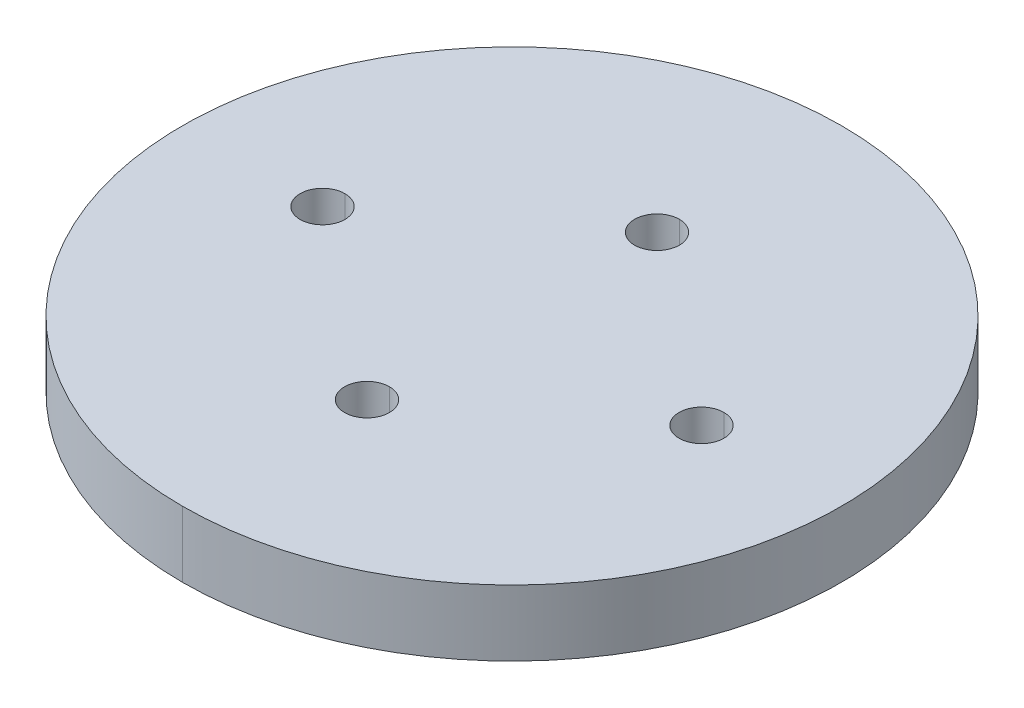
ISO-10303-21;
HEADER;
FILE_DESCRIPTION(('STEP AP214'),'2;1');
FILE_NAME('part.step','',(''),(''),'','','');
FILE_SCHEMA(('AUTOMOTIVE_DESIGN { 1 0 10303 214 1 1 1 1 }'));
ENDSEC;
DATA;
#1=APPLICATION_CONTEXT('core data for automotive mechanical design processes');
#2=APPLICATION_PROTOCOL_DEFINITION('international standard','automotive_design',2000,#1);
#3=PRODUCT_CONTEXT('',#1,'mechanical');
#4=PRODUCT('Part','Part','',(#3));
#5=PRODUCT_RELATED_PRODUCT_CATEGORY('part','',(#4));
#6=PRODUCT_DEFINITION_FORMATION('','',#4);
#7=PRODUCT_DEFINITION_CONTEXT('part definition',#1,'design');
#8=PRODUCT_DEFINITION('design','',#6,#7);
#9=PRODUCT_DEFINITION_SHAPE('','',#8);
#10=(LENGTH_UNIT() NAMED_UNIT(*) SI_UNIT(.MILLI.,.METRE.));
#11=(NAMED_UNIT(*) PLANE_ANGLE_UNIT() SI_UNIT($,.RADIAN.));
#12=(NAMED_UNIT(*) SI_UNIT($,.STERADIAN.) SOLID_ANGLE_UNIT());
#13=UNCERTAINTY_MEASURE_WITH_UNIT(LENGTH_MEASURE(1.E-05),#10,'distance_accuracy_value','');
#14=(GEOMETRIC_REPRESENTATION_CONTEXT(3) GLOBAL_UNCERTAINTY_ASSIGNED_CONTEXT((#13)) GLOBAL_UNIT_ASSIGNED_CONTEXT((#10,
#11,#12)) REPRESENTATION_CONTEXT('',''));
#15=CARTESIAN_POINT('',(0.,0.,0.));
#16=DIRECTION('',(0.,0.,1.));
#17=DIRECTION('',(1.,0.,0.));
#18=AXIS2_PLACEMENT_3D('',#15,#16,#17);
#19=CARTESIAN_POINT('',(0.,0.,0.));
#20=DIRECTION('',(0.,1.,0.));
#21=DIRECTION('',(1.,0.,0.));
#22=AXIS2_PLACEMENT_3D('',#19,#20,#21);
#23=PLANE('',#22);
#24=CARTESIAN_POINT('',(0.,0.,10.9993302496717));
#25=DIRECTION('',(0.,-1.,0.));
#26=DIRECTION('',(0.,0.,1.));
#27=AXIS2_PLACEMENT_3D('',#24,#25,#26);
#28=CIRCLE('',#27,1.7);
#29=CARTESIAN_POINT('',(0.,0.,9.29933024967169));
#30=VERTEX_POINT('',#29);
#31=CARTESIAN_POINT('',(0.,0.,12.6993302496717));
#32=VERTEX_POINT('',#31);
#33=EDGE_CURVE('E40',#30,#32,#28,.T.);
#34=ORIENTED_EDGE('',*,*,#33,.F.);
#35=CARTESIAN_POINT('',(0.,0.,10.9993302496717));
#36=DIRECTION('',(0.,-1.,0.));
#37=DIRECTION('',(0.,0.,1.));
#38=AXIS2_PLACEMENT_3D('',#35,#36,#37);
#39=CIRCLE('',#38,1.7);
#40=EDGE_CURVE('E165',#32,#30,#39,.T.);
#41=ORIENTED_EDGE('',*,*,#40,.F.);
#42=EDGE_LOOP('',(#34,#41));
#43=FACE_BOUND('',#42,.T.);
#44=CARTESIAN_POINT('',(-14.3744897137046,0.,0.));
#45=DIRECTION('',(0.,1.,0.));
#46=DIRECTION('',(0.,0.,1.));
#47=AXIS2_PLACEMENT_3D('',#44,#45,#46);
#48=CIRCLE('',#47,1.7);
#49=CARTESIAN_POINT('',(-14.3744897137046,0.,-1.7));
#50=VERTEX_POINT('',#49);
#51=CARTESIAN_POINT('',(-14.3744897137046,0.,1.7));
#52=VERTEX_POINT('',#51);
#53=EDGE_CURVE('E206',#50,#52,#48,.T.);
#54=ORIENTED_EDGE('',*,*,#53,.T.);
#55=CARTESIAN_POINT('',(-14.3744897137046,0.,0.));
#56=DIRECTION('',(0.,1.,0.));
#57=DIRECTION('',(0.,0.,1.));
#58=AXIS2_PLACEMENT_3D('',#55,#56,#57);
#59=CIRCLE('',#58,1.7);
#60=EDGE_CURVE('E175',#52,#50,#59,.T.);
#61=ORIENTED_EDGE('',*,*,#60,.T.);
#62=EDGE_LOOP('',(#54,#61));
#63=FACE_BOUND('',#62,.T.);
#64=CARTESIAN_POINT('',(0.,0.,-10.9993302496717));
#65=DIRECTION('',(0.,1.,0.));
#66=DIRECTION('',(0.,0.,1.));
#67=AXIS2_PLACEMENT_3D('',#64,#65,#66);
#68=CIRCLE('',#67,1.7);
#69=CARTESIAN_POINT('',(0.,0.,-12.6993302496717));
#70=VERTEX_POINT('',#69);
#71=CARTESIAN_POINT('',(0.,0.,-9.29933024967169));
#72=VERTEX_POINT('',#71);
#73=EDGE_CURVE('E201',#70,#72,#68,.T.);
#74=ORIENTED_EDGE('',*,*,#73,.T.);
#75=CARTESIAN_POINT('',(0.,0.,-10.9993302496717));
#76=DIRECTION('',(0.,1.,0.));
#77=DIRECTION('',(0.,0.,1.));
#78=AXIS2_PLACEMENT_3D('',#75,#76,#77);
#79=CIRCLE('',#78,1.7);
#80=EDGE_CURVE('E134',#72,#70,#79,.T.);
#81=ORIENTED_EDGE('',*,*,#80,.T.);
#82=EDGE_LOOP('',(#74,#81));
#83=FACE_BOUND('',#82,.T.);
#84=CARTESIAN_POINT('',(14.3744897137046,0.,0.));
#85=DIRECTION('',(0.,-1.,0.));
#86=DIRECTION('',(0.,0.,1.));
#87=AXIS2_PLACEMENT_3D('',#84,#85,#86);
#88=CIRCLE('',#87,1.7);
#89=CARTESIAN_POINT('',(14.3744897137046,0.,-1.7));
#90=VERTEX_POINT('',#89);
#91=CARTESIAN_POINT('',(14.3744897137046,0.,1.7));
#92=VERTEX_POINT('',#91);
#93=EDGE_CURVE('E133',#90,#92,#88,.T.);
#94=ORIENTED_EDGE('',*,*,#93,.F.);
#95=CARTESIAN_POINT('',(14.3744897137046,0.,0.));
#96=DIRECTION('',(0.,-1.,0.));
#97=DIRECTION('',(0.,0.,1.));
#98=AXIS2_PLACEMENT_3D('',#95,#96,#97);
#99=CIRCLE('',#98,1.7);
#100=EDGE_CURVE('E143',#92,#90,#99,.T.);
#101=ORIENTED_EDGE('',*,*,#100,.F.);
#102=EDGE_LOOP('',(#94,#101));
#103=FACE_BOUND('',#102,.T.);
#104=CARTESIAN_POINT('',(0.,0.,0.));
#105=DIRECTION('',(0.,1.,0.));
#106=DIRECTION('',(0.,0.,1.));
#107=AXIS2_PLACEMENT_3D('',#104,#105,#106);
#108=CIRCLE('',#107,25.);
#109=CARTESIAN_POINT('',(0.,0.,-25.));
#110=VERTEX_POINT('',#109);
#111=CARTESIAN_POINT('',(0.,0.,25.));
#112=VERTEX_POINT('',#111);
#113=EDGE_CURVE('E11',#110,#112,#108,.T.);
#114=ORIENTED_EDGE('',*,*,#113,.F.);
#115=CARTESIAN_POINT('',(0.,0.,0.));
#116=DIRECTION('',(0.,1.,0.));
#117=DIRECTION('',(0.,0.,1.));
#118=AXIS2_PLACEMENT_3D('',#115,#116,#117);
#119=CIRCLE('',#118,25.);
#120=EDGE_CURVE('E156',#112,#110,#119,.T.);
#121=ORIENTED_EDGE('',*,*,#120,.F.);
#122=EDGE_LOOP('',(#114,#121));
#123=FACE_BOUND('',#122,.T.);
#124=ADVANCED_FACE('F16',(#43,#63,#83,#103,#123),#23,.F.);
#125=CARTESIAN_POINT('',(0.,5.,0.));
#126=DIRECTION('',(0.,1.,0.));
#127=DIRECTION('',(1.,0.,0.));
#128=AXIS2_PLACEMENT_3D('',#125,#126,#127);
#129=PLANE('',#128);
#130=CARTESIAN_POINT('',(0.,5.,10.9993302496717));
#131=DIRECTION('',(0.,-1.,0.));
#132=DIRECTION('',(0.,0.,1.));
#133=AXIS2_PLACEMENT_3D('',#130,#131,#132);
#134=CIRCLE('',#133,1.7);
#135=CARTESIAN_POINT('',(0.,5.,9.29933024967169));
#136=VERTEX_POINT('',#135);
#137=CARTESIAN_POINT('',(0.,5.,12.6993302496717));
#138=VERTEX_POINT('',#137);
#139=EDGE_CURVE('E172',#136,#138,#134,.T.);
#140=ORIENTED_EDGE('',*,*,#139,.T.);
#141=CARTESIAN_POINT('',(0.,5.,10.9993302496717));
#142=DIRECTION('',(0.,-1.,0.));
#143=DIRECTION('',(0.,0.,1.));
#144=AXIS2_PLACEMENT_3D('',#141,#142,#143);
#145=CIRCLE('',#144,1.7);
#146=EDGE_CURVE('E19',#138,#136,#145,.T.);
#147=ORIENTED_EDGE('',*,*,#146,.T.);
#148=EDGE_LOOP('',(#140,#147));
#149=FACE_BOUND('',#148,.T.);
#150=CARTESIAN_POINT('',(-14.3744897137046,5.,0.));
#151=DIRECTION('',(0.,1.,0.));
#152=DIRECTION('',(0.,0.,1.));
#153=AXIS2_PLACEMENT_3D('',#150,#151,#152);
#154=CIRCLE('',#153,1.7);
#155=CARTESIAN_POINT('',(-14.3744897137046,5.,-1.7));
#156=VERTEX_POINT('',#155);
#157=CARTESIAN_POINT('',(-14.3744897137046,5.,1.7));
#158=VERTEX_POINT('',#157);
#159=EDGE_CURVE('E207',#156,#158,#154,.T.);
#160=ORIENTED_EDGE('',*,*,#159,.F.);
#161=CARTESIAN_POINT('',(-14.3744897137046,5.,0.));
#162=DIRECTION('',(0.,1.,0.));
#163=DIRECTION('',(0.,0.,1.));
#164=AXIS2_PLACEMENT_3D('',#161,#162,#163);
#165=CIRCLE('',#164,1.7);
#166=EDGE_CURVE('E76',#158,#156,#165,.T.);
#167=ORIENTED_EDGE('',*,*,#166,.F.);
#168=EDGE_LOOP('',(#160,#167));
#169=FACE_BOUND('',#168,.T.);
#170=CARTESIAN_POINT('',(0.,5.,-10.9993302496717));
#171=DIRECTION('',(0.,1.,0.));
#172=DIRECTION('',(0.,0.,1.));
#173=AXIS2_PLACEMENT_3D('',#170,#171,#172);
#174=CIRCLE('',#173,1.7);
#175=CARTESIAN_POINT('',(0.,5.,-12.6993302496717));
#176=VERTEX_POINT('',#175);
#177=CARTESIAN_POINT('',(0.,5.,-9.29933024967169));
#178=VERTEX_POINT('',#177);
#179=EDGE_CURVE('E167',#176,#178,#174,.T.);
#180=ORIENTED_EDGE('',*,*,#179,.F.);
#181=CARTESIAN_POINT('',(0.,5.,-10.9993302496717));
#182=DIRECTION('',(0.,1.,0.));
#183=DIRECTION('',(0.,0.,1.));
#184=AXIS2_PLACEMENT_3D('',#181,#182,#183);
#185=CIRCLE('',#184,1.7);
#186=EDGE_CURVE('E176',#178,#176,#185,.T.);
#187=ORIENTED_EDGE('',*,*,#186,.F.);
#188=EDGE_LOOP('',(#180,#187));
#189=FACE_BOUND('',#188,.T.);
#190=CARTESIAN_POINT('',(14.3744897137046,5.,0.));
#191=DIRECTION('',(0.,-1.,0.));
#192=DIRECTION('',(0.,0.,1.));
#193=AXIS2_PLACEMENT_3D('',#190,#191,#192);
#194=CIRCLE('',#193,1.7);
#195=CARTESIAN_POINT('',(14.3744897137046,5.,-1.7));
#196=VERTEX_POINT('',#195);
#197=CARTESIAN_POINT('',(14.3744897137046,5.,1.7));
#198=VERTEX_POINT('',#197);
#199=EDGE_CURVE('E123',#196,#198,#194,.T.);
#200=ORIENTED_EDGE('',*,*,#199,.T.);
#201=CARTESIAN_POINT('',(14.3744897137046,5.,0.));
#202=DIRECTION('',(0.,-1.,0.));
#203=DIRECTION('',(0.,0.,1.));
#204=AXIS2_PLACEMENT_3D('',#201,#202,#203);
#205=CIRCLE('',#204,1.7);
#206=EDGE_CURVE('E128',#198,#196,#205,.T.);
#207=ORIENTED_EDGE('',*,*,#206,.T.);
#208=EDGE_LOOP('',(#200,#207));
#209=FACE_BOUND('',#208,.T.);
#210=CARTESIAN_POINT('',(0.,5.,0.));
#211=DIRECTION('',(0.,1.,0.));
#212=DIRECTION('',(0.,0.,1.));
#213=AXIS2_PLACEMENT_3D('',#210,#211,#212);
#214=CIRCLE('',#213,25.);
#215=CARTESIAN_POINT('',(0.,5.,-25.));
#216=VERTEX_POINT('',#215);
#217=CARTESIAN_POINT('',(0.,5.,25.));
#218=VERTEX_POINT('',#217);
#219=EDGE_CURVE('E26',#216,#218,#214,.T.);
#220=ORIENTED_EDGE('',*,*,#219,.T.);
#221=CARTESIAN_POINT('',(0.,5.,0.));
#222=DIRECTION('',(0.,1.,0.));
#223=DIRECTION('',(0.,0.,1.));
#224=AXIS2_PLACEMENT_3D('',#221,#222,#223);
#225=CIRCLE('',#224,25.);
#226=EDGE_CURVE('E191',#218,#216,#225,.T.);
#227=ORIENTED_EDGE('',*,*,#226,.T.);
#228=EDGE_LOOP('',(#220,#227));
#229=FACE_BOUND('',#228,.T.);
#230=ADVANCED_FACE('F125',(#149,#169,#189,#209,#229),#129,.T.);
#231=CARTESIAN_POINT('',(0.,5.,0.));
#232=DIRECTION('',(0.,-1.,0.));
#233=DIRECTION('',(0.,0.,-1.));
#234=AXIS2_PLACEMENT_3D('',#231,#232,#233);
#235=CYLINDRICAL_SURFACE('',#234,25.);
#236=DIRECTION('',(0.,-1.,0.));
#237=VECTOR('',#236,1.);
#238=CARTESIAN_POINT('',(0.,5.,25.));
#239=LINE('',#238,#237);
#240=EDGE_CURVE('E187',#218,#112,#239,.T.);
#241=ORIENTED_EDGE('',*,*,#240,.F.);
#242=ORIENTED_EDGE('',*,*,#219,.F.);
#243=DIRECTION('',(0.,-1.,0.));
#244=VECTOR('',#243,1.);
#245=CARTESIAN_POINT('',(0.,5.,-25.));
#246=LINE('',#245,#244);
#247=EDGE_CURVE('E148',#216,#110,#246,.T.);
#248=ORIENTED_EDGE('',*,*,#247,.T.);
#249=ORIENTED_EDGE('',*,*,#113,.T.);
#250=EDGE_LOOP('',(#241,#242,#248,#249));
#251=FACE_BOUND('',#250,.T.);
#252=ADVANCED_FACE('F255',(#251),#235,.T.);
#253=CARTESIAN_POINT('',(14.3744897137046,5.,0.));
#254=DIRECTION('',(0.,-1.,0.));
#255=DIRECTION('',(0.,0.,-1.));
#256=AXIS2_PLACEMENT_3D('',#253,#254,#255);
#257=CYLINDRICAL_SURFACE('',#256,1.7);
#258=DIRECTION('',(0.,-1.,0.));
#259=VECTOR('',#258,1.);
#260=CARTESIAN_POINT('',(14.3744897137046,5.,1.7));
#261=LINE('',#260,#259);
#262=EDGE_CURVE('E137',#198,#92,#261,.T.);
#263=ORIENTED_EDGE('',*,*,#262,.F.);
#264=ORIENTED_EDGE('',*,*,#199,.F.);
#265=DIRECTION('',(0.,-1.,0.));
#266=VECTOR('',#265,1.);
#267=CARTESIAN_POINT('',(14.3744897137046,5.,-1.7));
#268=LINE('',#267,#266);
#269=EDGE_CURVE('E146',#196,#90,#268,.T.);
#270=ORIENTED_EDGE('',*,*,#269,.T.);
#271=ORIENTED_EDGE('',*,*,#93,.T.);
#272=EDGE_LOOP('',(#263,#264,#270,#271));
#273=FACE_BOUND('',#272,.T.);
#274=ADVANCED_FACE('F138',(#273),#257,.F.);
#275=CARTESIAN_POINT('',(0.,5.,-10.9993302496717));
#276=DIRECTION('',(0.,-1.,0.));
#277=DIRECTION('',(0.,0.,-1.));
#278=AXIS2_PLACEMENT_3D('',#275,#276,#277);
#279=CYLINDRICAL_SURFACE('',#278,1.7);
#280=DIRECTION('',(0.,-1.,0.));
#281=VECTOR('',#280,1.);
#282=CARTESIAN_POINT('',(0.,5.,-9.29933024967169));
#283=LINE('',#282,#281);
#284=EDGE_CURVE('E197',#178,#72,#283,.T.);
#285=ORIENTED_EDGE('',*,*,#284,.F.);
#286=ORIENTED_EDGE('',*,*,#186,.T.);
#287=DIRECTION('',(0.,-1.,0.));
#288=VECTOR('',#287,1.);
#289=CARTESIAN_POINT('',(0.,5.,-12.6993302496717));
#290=LINE('',#289,#288);
#291=EDGE_CURVE('E212',#176,#70,#290,.T.);
#292=ORIENTED_EDGE('',*,*,#291,.T.);
#293=ORIENTED_EDGE('',*,*,#80,.F.);
#294=EDGE_LOOP('',(#285,#286,#292,#293));
#295=FACE_BOUND('',#294,.T.);
#296=ADVANCED_FACE('F351',(#295),#279,.F.);
#297=CARTESIAN_POINT('',(-14.3744897137046,5.,0.));
#298=DIRECTION('',(0.,-1.,0.));
#299=DIRECTION('',(0.,0.,-1.));
#300=AXIS2_PLACEMENT_3D('',#297,#298,#299);
#301=CYLINDRICAL_SURFACE('',#300,1.7);
#302=DIRECTION('',(0.,-1.,0.));
#303=VECTOR('',#302,1.);
#304=CARTESIAN_POINT('',(-14.3744897137046,5.,1.7));
#305=LINE('',#304,#303);
#306=EDGE_CURVE('E202',#158,#52,#305,.T.);
#307=ORIENTED_EDGE('',*,*,#306,.F.);
#308=ORIENTED_EDGE('',*,*,#166,.T.);
#309=DIRECTION('',(0.,-1.,0.));
#310=VECTOR('',#309,1.);
#311=CARTESIAN_POINT('',(-14.3744897137046,5.,-1.7));
#312=LINE('',#311,#310);
#313=EDGE_CURVE('E160',#156,#50,#312,.T.);
#314=ORIENTED_EDGE('',*,*,#313,.T.);
#315=ORIENTED_EDGE('',*,*,#60,.F.);
#316=EDGE_LOOP('',(#307,#308,#314,#315));
#317=FACE_BOUND('',#316,.T.);
#318=ADVANCED_FACE('F355',(#317),#301,.F.);
#319=CARTESIAN_POINT('',(0.,5.,10.9993302496717));
#320=DIRECTION('',(0.,-1.,0.));
#321=DIRECTION('',(0.,0.,-1.));
#322=AXIS2_PLACEMENT_3D('',#319,#320,#321);
#323=CYLINDRICAL_SURFACE('',#322,1.7);
#324=DIRECTION('',(0.,-1.,0.));
#325=VECTOR('',#324,1.);
#326=CARTESIAN_POINT('',(0.,5.,12.6993302496717));
#327=LINE('',#326,#325);
#328=EDGE_CURVE('E162',#138,#32,#327,.T.);
#329=ORIENTED_EDGE('',*,*,#328,.F.);
#330=ORIENTED_EDGE('',*,*,#139,.F.);
#331=DIRECTION('',(0.,-1.,0.));
#332=VECTOR('',#331,1.);
#333=CARTESIAN_POINT('',(0.,5.,9.29933024967169));
#334=LINE('',#333,#332);
#335=EDGE_CURVE('E169',#136,#30,#334,.T.);
#336=ORIENTED_EDGE('',*,*,#335,.T.);
#337=ORIENTED_EDGE('',*,*,#33,.T.);
#338=EDGE_LOOP('',(#329,#330,#336,#337));
#339=FACE_BOUND('',#338,.T.);
#340=ADVANCED_FACE('F394',(#339),#323,.F.);
#341=CARTESIAN_POINT('',(0.,5.,10.9993302496717));
#342=DIRECTION('',(0.,-1.,0.));
#343=DIRECTION('',(0.,0.,-1.));
#344=AXIS2_PLACEMENT_3D('',#341,#342,#343);
#345=CYLINDRICAL_SURFACE('',#344,1.7);
#346=ORIENTED_EDGE('',*,*,#146,.F.);
#347=ORIENTED_EDGE('',*,*,#328,.T.);
#348=ORIENTED_EDGE('',*,*,#40,.T.);
#349=ORIENTED_EDGE('',*,*,#335,.F.);
#350=EDGE_LOOP('',(#346,#347,#348,#349));
#351=FACE_BOUND('',#350,.T.);
#352=ADVANCED_FACE('F242',(#351),#345,.F.);
#353=CARTESIAN_POINT('',(-14.3744897137046,5.,0.));
#354=DIRECTION('',(0.,-1.,0.));
#355=DIRECTION('',(0.,0.,-1.));
#356=AXIS2_PLACEMENT_3D('',#353,#354,#355);
#357=CYLINDRICAL_SURFACE('',#356,1.7);
#358=ORIENTED_EDGE('',*,*,#159,.T.);
#359=ORIENTED_EDGE('',*,*,#306,.T.);
#360=ORIENTED_EDGE('',*,*,#53,.F.);
#361=ORIENTED_EDGE('',*,*,#313,.F.);
#362=EDGE_LOOP('',(#358,#359,#360,#361));
#363=FACE_BOUND('',#362,.T.);
#364=ADVANCED_FACE('F364',(#363),#357,.F.);
#365=CARTESIAN_POINT('',(0.,5.,-10.9993302496717));
#366=DIRECTION('',(0.,-1.,0.));
#367=DIRECTION('',(0.,0.,-1.));
#368=AXIS2_PLACEMENT_3D('',#365,#366,#367);
#369=CYLINDRICAL_SURFACE('',#368,1.7);
#370=ORIENTED_EDGE('',*,*,#179,.T.);
#371=ORIENTED_EDGE('',*,*,#284,.T.);
#372=ORIENTED_EDGE('',*,*,#73,.F.);
#373=ORIENTED_EDGE('',*,*,#291,.F.);
#374=EDGE_LOOP('',(#370,#371,#372,#373));
#375=FACE_BOUND('',#374,.T.);
#376=ADVANCED_FACE('F360',(#375),#369,.F.);
#377=CARTESIAN_POINT('',(14.3744897137046,5.,0.));
#378=DIRECTION('',(0.,-1.,0.));
#379=DIRECTION('',(0.,0.,-1.));
#380=AXIS2_PLACEMENT_3D('',#377,#378,#379);
#381=CYLINDRICAL_SURFACE('',#380,1.7);
#382=ORIENTED_EDGE('',*,*,#206,.F.);
#383=ORIENTED_EDGE('',*,*,#262,.T.);
#384=ORIENTED_EDGE('',*,*,#100,.T.);
#385=ORIENTED_EDGE('',*,*,#269,.F.);
#386=EDGE_LOOP('',(#382,#383,#384,#385));
#387=FACE_BOUND('',#386,.T.);
#388=ADVANCED_FACE('F145',(#387),#381,.F.);
#389=CARTESIAN_POINT('',(0.,5.,0.));
#390=DIRECTION('',(0.,-1.,0.));
#391=DIRECTION('',(0.,0.,-1.));
#392=AXIS2_PLACEMENT_3D('',#389,#390,#391);
#393=CYLINDRICAL_SURFACE('',#392,25.);
#394=ORIENTED_EDGE('',*,*,#226,.F.);
#395=ORIENTED_EDGE('',*,*,#240,.T.);
#396=ORIENTED_EDGE('',*,*,#120,.T.);
#397=ORIENTED_EDGE('',*,*,#247,.F.);
#398=EDGE_LOOP('',(#394,#395,#396,#397));
#399=FACE_BOUND('',#398,.T.);
#400=ADVANCED_FACE('F258',(#399),#393,.T.);
#401=CLOSED_SHELL('',(#124,#230,#252,#274,#296,#318,#340,#352,#364,#376,#388,#400));
#402=MANIFOLD_SOLID_BREP('B1',#401);
#403=ADVANCED_BREP_SHAPE_REPRESENTATION('',(#18,#402),#14);
#404=SHAPE_DEFINITION_REPRESENTATION(#9,#403);
ENDSEC;
END-ISO-10303-21;
